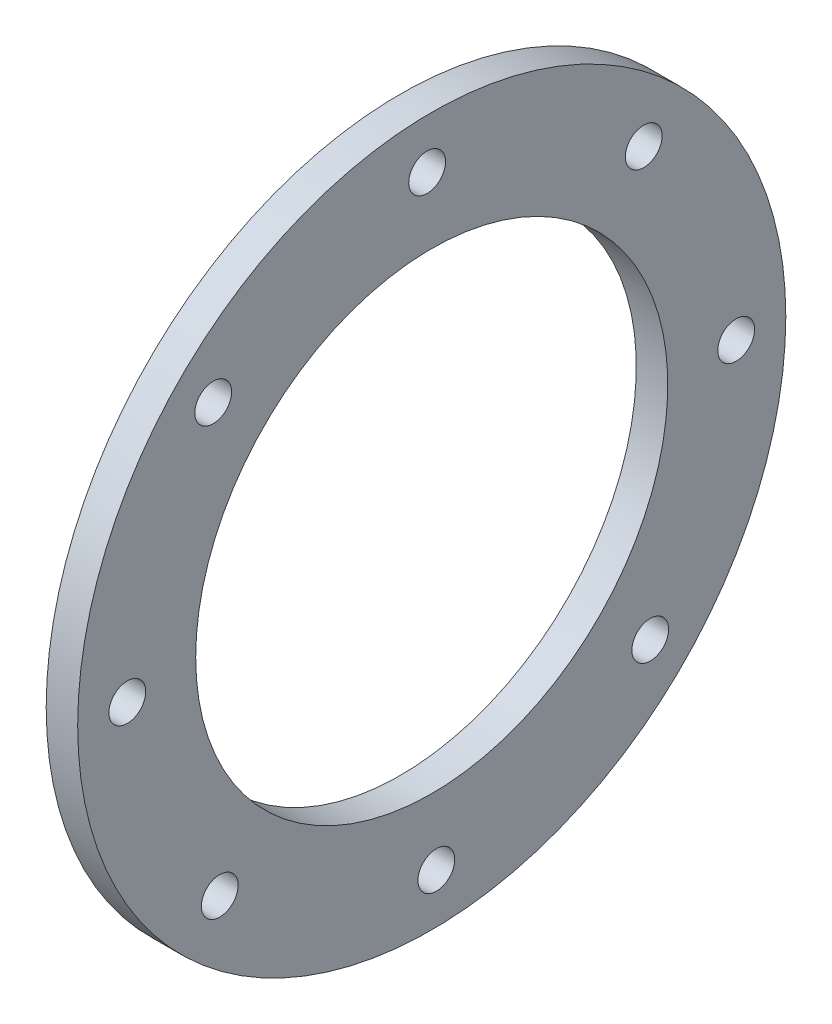
ISO-10303-21;
HEADER;
FILE_DESCRIPTION(('STEP AP214'),'2;1');
FILE_NAME('part.step','',(''),(''),'','','');
FILE_SCHEMA(('AUTOMOTIVE_DESIGN { 1 0 10303 214 1 1 1 1 }'));
ENDSEC;
DATA;
#1=APPLICATION_CONTEXT('core data for automotive mechanical design processes');
#2=APPLICATION_PROTOCOL_DEFINITION('international standard','automotive_design',2000,#1);
#3=PRODUCT_CONTEXT('',#1,'mechanical');
#4=PRODUCT('Part','Part','',(#3));
#5=PRODUCT_RELATED_PRODUCT_CATEGORY('part','',(#4));
#6=PRODUCT_DEFINITION_FORMATION('','',#4);
#7=PRODUCT_DEFINITION_CONTEXT('part definition',#1,'design');
#8=PRODUCT_DEFINITION('design','',#6,#7);
#9=PRODUCT_DEFINITION_SHAPE('','',#8);
#10=(LENGTH_UNIT() NAMED_UNIT(*) SI_UNIT(.MILLI.,.METRE.));
#11=(NAMED_UNIT(*) PLANE_ANGLE_UNIT() SI_UNIT($,.RADIAN.));
#12=(NAMED_UNIT(*) SI_UNIT($,.STERADIAN.) SOLID_ANGLE_UNIT());
#13=UNCERTAINTY_MEASURE_WITH_UNIT(LENGTH_MEASURE(1.E-05),#10,'distance_accuracy_value','');
#14=(GEOMETRIC_REPRESENTATION_CONTEXT(3) GLOBAL_UNCERTAINTY_ASSIGNED_CONTEXT((#13)) GLOBAL_UNIT_ASSIGNED_CONTEXT((#10,
#11,#12)) REPRESENTATION_CONTEXT('',''));
#15=CARTESIAN_POINT('',(0.,0.,0.));
#16=DIRECTION('',(0.,0.,1.));
#17=DIRECTION('',(1.,0.,0.));
#18=AXIS2_PLACEMENT_3D('',#15,#16,#17);
#19=CARTESIAN_POINT('',(0.,0.,0.));
#20=DIRECTION('',(-1.,0.,0.));
#21=DIRECTION('',(0.,0.,1.));
#22=AXIS2_PLACEMENT_3D('',#19,#20,#21);
#23=CYLINDRICAL_SURFACE('',#22,45.);
#24=CARTESIAN_POINT('',(-2.00000000000001,0.,0.));
#25=DIRECTION('',(-1.,0.,0.));
#26=DIRECTION('',(0.,0.,1.));
#27=AXIS2_PLACEMENT_3D('',#24,#25,#26);
#28=CIRCLE('',#27,45.);
#29=CARTESIAN_POINT('',(-2.00000000000001,0.,45.));
#30=VERTEX_POINT('',#29);
#31=EDGE_CURVE('E10',#30,#30,#28,.T.);
#32=ORIENTED_EDGE('',*,*,#31,.F.);
#33=EDGE_LOOP('',(#32));
#34=FACE_BOUND('',#33,.T.);
#35=CARTESIAN_POINT('',(2.,0.,0.));
#36=DIRECTION('',(-1.,0.,0.));
#37=DIRECTION('',(0.,0.,1.));
#38=AXIS2_PLACEMENT_3D('',#35,#36,#37);
#39=CIRCLE('',#38,45.);
#40=CARTESIAN_POINT('',(2.,0.,45.));
#41=VERTEX_POINT('',#40);
#42=EDGE_CURVE('E60',#41,#41,#39,.T.);
#43=ORIENTED_EDGE('',*,*,#42,.T.);
#44=EDGE_LOOP('',(#43));
#45=FACE_BOUND('',#44,.T.);
#46=ADVANCED_FACE('F43',(#34,#45),#23,.T.);
#47=CARTESIAN_POINT('',(-2.,30.,0.));
#48=DIRECTION('',(1.,0.,0.));
#49=DIRECTION('',(0.,0.,-1.));
#50=AXIS2_PLACEMENT_3D('',#47,#48,#49);
#51=PLANE('',#50);
#52=CARTESIAN_POINT('',(-2.,38.6897854253689,0.585786437626297));
#53=DIRECTION('',(-1.,0.,0.));
#54=DIRECTION('',(0.,0.,1.));
#55=AXIS2_PLACEMENT_3D('',#52,#53,#54);
#56=CIRCLE('',#55,2.33955102178938);
#57=CARTESIAN_POINT('',(-2.,38.6897854253689,2.92533745941567));
#58=VERTEX_POINT('',#57);
#59=EDGE_CURVE('E120',#58,#58,#56,.T.);
#60=ORIENTED_EDGE('',*,*,#59,.F.);
#61=EDGE_LOOP('',(#60));
#62=FACE_BOUND('',#61,.T.);
#63=CARTESIAN_POINT('',(-2.,26.9435960745581,27.7720231993034));
#64=DIRECTION('',(-1.,0.,0.));
#65=DIRECTION('',(0.,0.,1.));
#66=AXIS2_PLACEMENT_3D('',#63,#64,#65);
#67=CIRCLE('',#66,2.33955102178938);
#68=CARTESIAN_POINT('',(-2.,26.9435960745581,30.1115742210928));
#69=VERTEX_POINT('',#68);
#70=EDGE_CURVE('E116',#69,#69,#67,.T.);
#71=ORIENTED_EDGE('',*,*,#70,.F.);
#72=EDGE_LOOP('',(#71));
#73=FACE_BOUND('',#72,.T.);
#74=CARTESIAN_POINT('',(-2.,-0.585786437626295,38.6897854253689));
#75=DIRECTION('',(-1.,0.,0.));
#76=DIRECTION('',(0.,0.,1.));
#77=AXIS2_PLACEMENT_3D('',#74,#75,#76);
#78=CIRCLE('',#77,2.33955102178938);
#79=CARTESIAN_POINT('',(-2.,-0.585786437626295,41.0293364471582));
#80=VERTEX_POINT('',#79);
#81=EDGE_CURVE('E108',#80,#80,#78,.T.);
#82=ORIENTED_EDGE('',*,*,#81,.F.);
#83=EDGE_LOOP('',(#82));
#84=FACE_BOUND('',#83,.T.);
#85=CARTESIAN_POINT('',(-2.,-27.7720231993034,26.9435960745581));
#86=DIRECTION('',(-1.,0.,0.));
#87=DIRECTION('',(0.,0.,1.));
#88=AXIS2_PLACEMENT_3D('',#85,#86,#87);
#89=CIRCLE('',#88,2.33955102178938);
#90=CARTESIAN_POINT('',(-2.,-27.7720231993034,29.2831470963475));
#91=VERTEX_POINT('',#90);
#92=EDGE_CURVE('E100',#91,#91,#89,.T.);
#93=ORIENTED_EDGE('',*,*,#92,.F.);
#94=EDGE_LOOP('',(#93));
#95=FACE_BOUND('',#94,.T.);
#96=CARTESIAN_POINT('',(-2.,-38.6897854253689,-0.585786437626292));
#97=DIRECTION('',(-1.,0.,0.));
#98=DIRECTION('',(0.,0.,1.));
#99=AXIS2_PLACEMENT_3D('',#96,#97,#98);
#100=CIRCLE('',#99,2.33955102178938);
#101=CARTESIAN_POINT('',(-2.,-38.6897854253689,1.75376458416308));
#102=VERTEX_POINT('',#101);
#103=EDGE_CURVE('E92',#102,#102,#100,.T.);
#104=ORIENTED_EDGE('',*,*,#103,.F.);
#105=EDGE_LOOP('',(#104));
#106=FACE_BOUND('',#105,.T.);
#107=CARTESIAN_POINT('',(-2.,-26.9435960745581,-27.7720231993034));
#108=DIRECTION('',(-1.,0.,0.));
#109=DIRECTION('',(0.,0.,1.));
#110=AXIS2_PLACEMENT_3D('',#107,#108,#109);
#111=CIRCLE('',#110,2.33955102178938);
#112=CARTESIAN_POINT('',(-2.,-26.9435960745581,-25.4324721775141));
#113=VERTEX_POINT('',#112);
#114=EDGE_CURVE('E84',#113,#113,#111,.T.);
#115=ORIENTED_EDGE('',*,*,#114,.F.);
#116=EDGE_LOOP('',(#115));
#117=FACE_BOUND('',#116,.T.);
#118=CARTESIAN_POINT('',(-2.,0.58578643762629,-38.6897854253689));
#119=DIRECTION('',(-1.,0.,0.));
#120=DIRECTION('',(0.,0.,1.));
#121=AXIS2_PLACEMENT_3D('',#118,#119,#120);
#122=CIRCLE('',#121,2.33955102178938);
#123=CARTESIAN_POINT('',(-2.,0.58578643762629,-36.3502344035795));
#124=VERTEX_POINT('',#123);
#125=EDGE_CURVE('E76',#124,#124,#122,.T.);
#126=ORIENTED_EDGE('',*,*,#125,.F.);
#127=EDGE_LOOP('',(#126));
#128=FACE_BOUND('',#127,.T.);
#129=CARTESIAN_POINT('',(-2.,27.7720231993034,-26.9435960745581));
#130=DIRECTION('',(-1.,0.,0.));
#131=DIRECTION('',(0.,0.,1.));
#132=AXIS2_PLACEMENT_3D('',#129,#130,#131);
#133=CIRCLE('',#132,2.33955102178937);
#134=CARTESIAN_POINT('',(-2.,27.7720231993034,-24.6040450527687));
#135=VERTEX_POINT('',#134);
#136=EDGE_CURVE('E67',#135,#135,#133,.T.);
#137=ORIENTED_EDGE('',*,*,#136,.F.);
#138=EDGE_LOOP('',(#137));
#139=FACE_BOUND('',#138,.T.);
#140=CARTESIAN_POINT('',(-2.,0.,0.));
#141=DIRECTION('',(-1.,0.,0.));
#142=DIRECTION('',(0.,0.,1.));
#143=AXIS2_PLACEMENT_3D('',#140,#141,#142);
#144=CIRCLE('',#143,30.);
#145=CARTESIAN_POINT('',(-2.,0.,30.));
#146=VERTEX_POINT('',#145);
#147=EDGE_CURVE('E50',#146,#146,#144,.T.);
#148=ORIENTED_EDGE('',*,*,#147,.F.);
#149=EDGE_LOOP('',(#148));
#150=FACE_BOUND('',#149,.T.);
#151=ORIENTED_EDGE('',*,*,#31,.T.);
#152=EDGE_LOOP('',(#151));
#153=FACE_BOUND('',#152,.T.);
#154=ADVANCED_FACE('F133',(#62,#73,#84,#95,#106,#117,#128,#139,#150,#153),#51,.F.);
#155=CARTESIAN_POINT('',(0.,0.,0.));
#156=DIRECTION('',(-1.,0.,0.));
#157=DIRECTION('',(0.,0.,1.));
#158=AXIS2_PLACEMENT_3D('',#155,#156,#157);
#159=CYLINDRICAL_SURFACE('',#158,30.);
#160=CARTESIAN_POINT('',(2.,0.,0.));
#161=DIRECTION('',(-1.,0.,0.));
#162=DIRECTION('',(0.,0.,1.));
#163=AXIS2_PLACEMENT_3D('',#160,#161,#162);
#164=CIRCLE('',#163,30.);
#165=CARTESIAN_POINT('',(2.,0.,30.));
#166=VERTEX_POINT('',#165);
#167=EDGE_CURVE('E55',#166,#166,#164,.T.);
#168=ORIENTED_EDGE('',*,*,#167,.F.);
#169=EDGE_LOOP('',(#168));
#170=FACE_BOUND('',#169,.T.);
#171=ORIENTED_EDGE('',*,*,#147,.T.);
#172=EDGE_LOOP('',(#171));
#173=FACE_BOUND('',#172,.T.);
#174=ADVANCED_FACE('F136',(#170,#173),#159,.F.);
#175=CARTESIAN_POINT('',(2.,30.,0.));
#176=DIRECTION('',(-1.,0.,0.));
#177=DIRECTION('',(0.,0.,1.));
#178=AXIS2_PLACEMENT_3D('',#175,#176,#177);
#179=PLANE('',#178);
#180=CARTESIAN_POINT('',(2.,38.6897854253689,0.585786437626297));
#181=DIRECTION('',(-1.,0.,0.));
#182=DIRECTION('',(0.,0.,1.));
#183=AXIS2_PLACEMENT_3D('',#180,#181,#182);
#184=CIRCLE('',#183,2.33955102178938);
#185=CARTESIAN_POINT('',(2.,38.6897854253689,2.92533745941567));
#186=VERTEX_POINT('',#185);
#187=EDGE_CURVE('E66',#186,#186,#184,.F.);
#188=ORIENTED_EDGE('',*,*,#187,.F.);
#189=EDGE_LOOP('',(#188));
#190=FACE_BOUND('',#189,.T.);
#191=CARTESIAN_POINT('',(2.,26.9435960745581,27.7720231993034));
#192=DIRECTION('',(-1.,0.,0.));
#193=DIRECTION('',(0.,0.,1.));
#194=AXIS2_PLACEMENT_3D('',#191,#192,#193);
#195=CIRCLE('',#194,2.33955102178938);
#196=CARTESIAN_POINT('',(2.,26.9435960745581,30.1115742210928));
#197=VERTEX_POINT('',#196);
#198=EDGE_CURVE('E112',#197,#197,#195,.F.);
#199=ORIENTED_EDGE('',*,*,#198,.F.);
#200=EDGE_LOOP('',(#199));
#201=FACE_BOUND('',#200,.T.);
#202=CARTESIAN_POINT('',(2.,-0.585786437626295,38.6897854253689));
#203=DIRECTION('',(-1.,0.,0.));
#204=DIRECTION('',(0.,0.,1.));
#205=AXIS2_PLACEMENT_3D('',#202,#203,#204);
#206=CIRCLE('',#205,2.33955102178938);
#207=CARTESIAN_POINT('',(2.,-0.585786437626295,41.0293364471582));
#208=VERTEX_POINT('',#207);
#209=EDGE_CURVE('E104',#208,#208,#206,.F.);
#210=ORIENTED_EDGE('',*,*,#209,.F.);
#211=EDGE_LOOP('',(#210));
#212=FACE_BOUND('',#211,.T.);
#213=CARTESIAN_POINT('',(2.,-27.7720231993034,26.9435960745581));
#214=DIRECTION('',(-1.,0.,0.));
#215=DIRECTION('',(0.,0.,1.));
#216=AXIS2_PLACEMENT_3D('',#213,#214,#215);
#217=CIRCLE('',#216,2.33955102178938);
#218=CARTESIAN_POINT('',(2.,-27.7720231993034,29.2831470963475));
#219=VERTEX_POINT('',#218);
#220=EDGE_CURVE('E96',#219,#219,#217,.F.);
#221=ORIENTED_EDGE('',*,*,#220,.F.);
#222=EDGE_LOOP('',(#221));
#223=FACE_BOUND('',#222,.T.);
#224=CARTESIAN_POINT('',(2.,-38.6897854253689,-0.585786437626292));
#225=DIRECTION('',(-1.,0.,0.));
#226=DIRECTION('',(0.,0.,1.));
#227=AXIS2_PLACEMENT_3D('',#224,#225,#226);
#228=CIRCLE('',#227,2.33955102178938);
#229=CARTESIAN_POINT('',(2.,-38.6897854253689,1.75376458416308));
#230=VERTEX_POINT('',#229);
#231=EDGE_CURVE('E88',#230,#230,#228,.F.);
#232=ORIENTED_EDGE('',*,*,#231,.F.);
#233=EDGE_LOOP('',(#232));
#234=FACE_BOUND('',#233,.T.);
#235=CARTESIAN_POINT('',(2.,-26.9435960745581,-27.7720231993034));
#236=DIRECTION('',(-1.,0.,0.));
#237=DIRECTION('',(0.,0.,1.));
#238=AXIS2_PLACEMENT_3D('',#235,#236,#237);
#239=CIRCLE('',#238,2.33955102178938);
#240=CARTESIAN_POINT('',(2.,-26.9435960745581,-25.4324721775141));
#241=VERTEX_POINT('',#240);
#242=EDGE_CURVE('E80',#241,#241,#239,.F.);
#243=ORIENTED_EDGE('',*,*,#242,.F.);
#244=EDGE_LOOP('',(#243));
#245=FACE_BOUND('',#244,.T.);
#246=CARTESIAN_POINT('',(2.,0.58578643762629,-38.6897854253689));
#247=DIRECTION('',(-1.,0.,0.));
#248=DIRECTION('',(0.,0.,1.));
#249=AXIS2_PLACEMENT_3D('',#246,#247,#248);
#250=CIRCLE('',#249,2.33955102178938);
#251=CARTESIAN_POINT('',(2.,0.58578643762629,-36.3502344035795));
#252=VERTEX_POINT('',#251);
#253=EDGE_CURVE('E71',#252,#252,#250,.F.);
#254=ORIENTED_EDGE('',*,*,#253,.F.);
#255=EDGE_LOOP('',(#254));
#256=FACE_BOUND('',#255,.T.);
#257=CARTESIAN_POINT('',(2.,27.7720231993034,-26.9435960745581));
#258=DIRECTION('',(-1.,0.,0.));
#259=DIRECTION('',(0.,0.,1.));
#260=AXIS2_PLACEMENT_3D('',#257,#258,#259);
#261=CIRCLE('',#260,2.33955102178937);
#262=CARTESIAN_POINT('',(2.,27.7720231993034,-24.6040450527687));
#263=VERTEX_POINT('',#262);
#264=EDGE_CURVE('E72',#263,#263,#261,.F.);
#265=ORIENTED_EDGE('',*,*,#264,.F.);
#266=EDGE_LOOP('',(#265));
#267=FACE_BOUND('',#266,.T.);
#268=ORIENTED_EDGE('',*,*,#42,.F.);
#269=EDGE_LOOP('',(#268));
#270=FACE_BOUND('',#269,.T.);
#271=ORIENTED_EDGE('',*,*,#167,.T.);
#272=EDGE_LOOP('',(#271));
#273=FACE_BOUND('',#272,.T.);
#274=ADVANCED_FACE('F155',(#190,#201,#212,#223,#234,#245,#256,#267,#270,#273),#179,.F.);
#275=CARTESIAN_POINT('',(8.61724956975675,27.7720231993034,-26.9435960745581));
#276=DIRECTION('',(-1.,0.,0.));
#277=DIRECTION('',(0.,0.,1.));
#278=AXIS2_PLACEMENT_3D('',#275,#276,#277);
#279=CYLINDRICAL_SURFACE('',#278,2.33955102178937);
#280=ORIENTED_EDGE('',*,*,#264,.T.);
#281=EDGE_LOOP('',(#280));
#282=FACE_BOUND('',#281,.T.);
#283=ORIENTED_EDGE('',*,*,#136,.T.);
#284=EDGE_LOOP('',(#283));
#285=FACE_BOUND('',#284,.T.);
#286=ADVANCED_FACE('F152',(#282,#285),#279,.F.);
#287=CARTESIAN_POINT('',(8.61724956975675,0.58578643762629,-38.6897854253689));
#288=DIRECTION('',(-1.,0.,0.));
#289=DIRECTION('',(0.,0.,1.));
#290=AXIS2_PLACEMENT_3D('',#287,#288,#289);
#291=CYLINDRICAL_SURFACE('',#290,2.33955102178938);
#292=ORIENTED_EDGE('',*,*,#253,.T.);
#293=EDGE_LOOP('',(#292));
#294=FACE_BOUND('',#293,.T.);
#295=ORIENTED_EDGE('',*,*,#125,.T.);
#296=EDGE_LOOP('',(#295));
#297=FACE_BOUND('',#296,.T.);
#298=ADVANCED_FACE('F154',(#294,#297),#291,.F.);
#299=CARTESIAN_POINT('',(8.61724956975675,-26.9435960745581,-27.7720231993034));
#300=DIRECTION('',(-1.,0.,0.));
#301=DIRECTION('',(0.,0.,1.));
#302=AXIS2_PLACEMENT_3D('',#299,#300,#301);
#303=CYLINDRICAL_SURFACE('',#302,2.33955102178938);
#304=ORIENTED_EDGE('',*,*,#242,.T.);
#305=EDGE_LOOP('',(#304));
#306=FACE_BOUND('',#305,.T.);
#307=ORIENTED_EDGE('',*,*,#114,.T.);
#308=EDGE_LOOP('',(#307));
#309=FACE_BOUND('',#308,.T.);
#310=ADVANCED_FACE('F162',(#306,#309),#303,.F.);
#311=CARTESIAN_POINT('',(8.61724956975675,-38.6897854253689,-0.585786437626292));
#312=DIRECTION('',(-1.,0.,0.));
#313=DIRECTION('',(0.,0.,1.));
#314=AXIS2_PLACEMENT_3D('',#311,#312,#313);
#315=CYLINDRICAL_SURFACE('',#314,2.33955102178938);
#316=ORIENTED_EDGE('',*,*,#231,.T.);
#317=EDGE_LOOP('',(#316));
#318=FACE_BOUND('',#317,.T.);
#319=ORIENTED_EDGE('',*,*,#103,.T.);
#320=EDGE_LOOP('',(#319));
#321=FACE_BOUND('',#320,.T.);
#322=ADVANCED_FACE('F211',(#318,#321),#315,.F.);
#323=CARTESIAN_POINT('',(8.61724956975675,-27.7720231993034,26.9435960745581));
#324=DIRECTION('',(-1.,0.,0.));
#325=DIRECTION('',(0.,0.,1.));
#326=AXIS2_PLACEMENT_3D('',#323,#324,#325);
#327=CYLINDRICAL_SURFACE('',#326,2.33955102178938);
#328=ORIENTED_EDGE('',*,*,#220,.T.);
#329=EDGE_LOOP('',(#328));
#330=FACE_BOUND('',#329,.T.);
#331=ORIENTED_EDGE('',*,*,#92,.T.);
#332=EDGE_LOOP('',(#331));
#333=FACE_BOUND('',#332,.T.);
#334=ADVANCED_FACE('F221',(#330,#333),#327,.F.);
#335=CARTESIAN_POINT('',(8.61724956975675,-0.585786437626295,38.6897854253689));
#336=DIRECTION('',(-1.,0.,0.));
#337=DIRECTION('',(0.,0.,1.));
#338=AXIS2_PLACEMENT_3D('',#335,#336,#337);
#339=CYLINDRICAL_SURFACE('',#338,2.33955102178938);
#340=ORIENTED_EDGE('',*,*,#209,.T.);
#341=EDGE_LOOP('',(#340));
#342=FACE_BOUND('',#341,.T.);
#343=ORIENTED_EDGE('',*,*,#81,.T.);
#344=EDGE_LOOP('',(#343));
#345=FACE_BOUND('',#344,.T.);
#346=ADVANCED_FACE('F231',(#342,#345),#339,.F.);
#347=CARTESIAN_POINT('',(8.61724956975675,26.9435960745581,27.7720231993034));
#348=DIRECTION('',(-1.,0.,0.));
#349=DIRECTION('',(0.,0.,1.));
#350=AXIS2_PLACEMENT_3D('',#347,#348,#349);
#351=CYLINDRICAL_SURFACE('',#350,2.33955102178938);
#352=ORIENTED_EDGE('',*,*,#198,.T.);
#353=EDGE_LOOP('',(#352));
#354=FACE_BOUND('',#353,.T.);
#355=ORIENTED_EDGE('',*,*,#70,.T.);
#356=EDGE_LOOP('',(#355));
#357=FACE_BOUND('',#356,.T.);
#358=ADVANCED_FACE('F241',(#354,#357),#351,.F.);
#359=CARTESIAN_POINT('',(8.61724956975675,38.6897854253689,0.585786437626297));
#360=DIRECTION('',(-1.,0.,0.));
#361=DIRECTION('',(0.,0.,1.));
#362=AXIS2_PLACEMENT_3D('',#359,#360,#361);
#363=CYLINDRICAL_SURFACE('',#362,2.33955102178938);
#364=ORIENTED_EDGE('',*,*,#187,.T.);
#365=EDGE_LOOP('',(#364));
#366=FACE_BOUND('',#365,.T.);
#367=ORIENTED_EDGE('',*,*,#59,.T.);
#368=EDGE_LOOP('',(#367));
#369=FACE_BOUND('',#368,.T.);
#370=ADVANCED_FACE('F131',(#366,#369),#363,.F.);
#371=CLOSED_SHELL('',(#46,#154,#174,#274,#286,#298,#310,#322,#334,#346,#358,#370));
#372=MANIFOLD_SOLID_BREP('B2',#371);
#373=ADVANCED_BREP_SHAPE_REPRESENTATION('',(#18,#372),#14);
#374=SHAPE_DEFINITION_REPRESENTATION(#9,#373);
ENDSEC;
END-ISO-10303-21;
